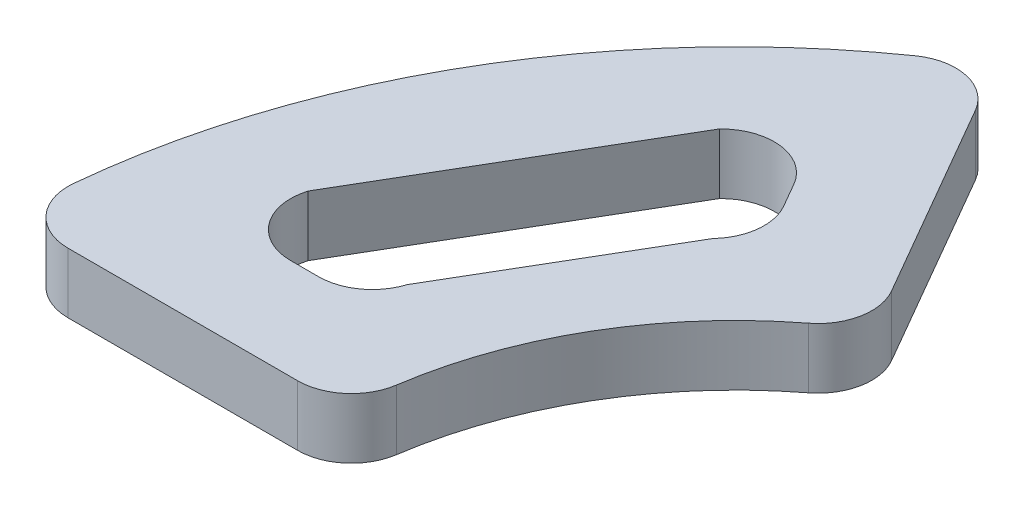
ISO-10303-21;
HEADER;
FILE_DESCRIPTION(('STEP AP214'),'2;1');
FILE_NAME('part.step','',(''),(''),'','','');
FILE_SCHEMA(('AUTOMOTIVE_DESIGN { 1 0 10303 214 1 1 1 1 }'));
ENDSEC;
DATA;
#1=APPLICATION_CONTEXT('core data for automotive mechanical design processes');
#2=APPLICATION_PROTOCOL_DEFINITION('international standard','automotive_design',2000,#1);
#3=PRODUCT_CONTEXT('',#1,'mechanical');
#4=PRODUCT('Part','Part','',(#3));
#5=PRODUCT_RELATED_PRODUCT_CATEGORY('part','',(#4));
#6=PRODUCT_DEFINITION_FORMATION('','',#4);
#7=PRODUCT_DEFINITION_CONTEXT('part definition',#1,'design');
#8=PRODUCT_DEFINITION('design','',#6,#7);
#9=PRODUCT_DEFINITION_SHAPE('','',#8);
#10=(LENGTH_UNIT() NAMED_UNIT(*) SI_UNIT(.MILLI.,.METRE.));
#11=(NAMED_UNIT(*) PLANE_ANGLE_UNIT() SI_UNIT($,.RADIAN.));
#12=(NAMED_UNIT(*) SI_UNIT($,.STERADIAN.) SOLID_ANGLE_UNIT());
#13=UNCERTAINTY_MEASURE_WITH_UNIT(LENGTH_MEASURE(1.E-05),#10,'distance_accuracy_value','');
#14=(GEOMETRIC_REPRESENTATION_CONTEXT(3) GLOBAL_UNCERTAINTY_ASSIGNED_CONTEXT((#13)) GLOBAL_UNIT_ASSIGNED_CONTEXT((#10,
#11,#12)) REPRESENTATION_CONTEXT('',''));
#15=CARTESIAN_POINT('',(0.,0.,0.));
#16=DIRECTION('',(0.,0.,1.));
#17=DIRECTION('',(1.,0.,0.));
#18=AXIS2_PLACEMENT_3D('',#15,#16,#17);
#19=CARTESIAN_POINT('',(-101.508620323596,4.5,-10.));
#20=DIRECTION('',(0.,1.,0.));
#21=DIRECTION('',(0.,0.,1.));
#22=AXIS2_PLACEMENT_3D('',#19,#20,#21);
#23=PLANE('',#22);
#24=CARTESIAN_POINT('',(-101.508620323596,4.5,-10.));
#25=DIRECTION('',(0.,1.,0.));
#26=DIRECTION('',(0.,0.,1.));
#27=AXIS2_PLACEMENT_3D('',#24,#25,#26);
#28=CIRCLE('',#27,8.);
#29=CARTESIAN_POINT('',(-109.470080741133,4.5,-10.7843137254902));
#30=VERTEX_POINT('',#29);
#31=CARTESIAN_POINT('',(-101.508620323596,4.5,-2.));
#32=VERTEX_POINT('',#31);
#33=EDGE_CURVE('E214',#30,#32,#28,.T.);
#34=ORIENTED_EDGE('',*,*,#33,.T.);
#35=DIRECTION('',(1.,0.,0.));
#36=VECTOR('',#35,1.);
#37=CARTESIAN_POINT('',(-101.508620323596,4.5,-2.));
#38=LINE('',#37,#36);
#39=CARTESIAN_POINT('',(-67.2606868832009,4.5,-2.));
#40=VERTEX_POINT('',#39);
#41=EDGE_CURVE('E217',#32,#40,#38,.T.);
#42=ORIENTED_EDGE('',*,*,#41,.T.);
#43=CARTESIAN_POINT('',(-67.2606868832009,4.5,-10.));
#44=DIRECTION('',(0.,1.,0.));
#45=DIRECTION('',(0.,0.,1.));
#46=AXIS2_PLACEMENT_3D('',#43,#44,#45);
#47=CIRCLE('',#46,8.);
#48=CARTESIAN_POINT('',(-59.347664896942,4.5,-8.82352941176468));
#49=VERTEX_POINT('',#48);
#50=EDGE_CURVE('E220',#40,#49,#47,.T.);
#51=ORIENTED_EDGE('',*,*,#50,.T.);
#52=CARTESIAN_POINT('',(0.,4.5,0.));
#53=DIRECTION('',(0.,-1.,0.));
#54=DIRECTION('',(0.,0.,-1.));
#55=AXIS2_PLACEMENT_3D('',#52,#53,#54);
#56=CIRCLE('',#55,60.);
#57=CARTESIAN_POINT('',(-36.6133401441332,4.5,-47.5338124232635));
#58=VERTEX_POINT('',#57);
#59=EDGE_CURVE('E222',#49,#58,#56,.T.);
#60=ORIENTED_EDGE('',*,*,#59,.T.);
#61=CARTESIAN_POINT('',(-41.4951188300176,4.5,-53.8716540796987));
#62=DIRECTION('',(0.,1.,0.));
#63=DIRECTION('',(0.,0.,-1.));
#64=AXIS2_PLACEMENT_3D('',#61,#62,#63);
#65=CIRCLE('',#64,8.);
#66=CARTESIAN_POINT('',(-34.5669155997421,4.5,-57.8716540796986));
#67=VERTEX_POINT('',#66);
#68=EDGE_CURVE('E224',#58,#67,#65,.T.);
#69=ORIENTED_EDGE('',*,*,#68,.T.);
#70=DIRECTION('',(-0.499999999999998,0.,-0.86602540378444));
#71=VECTOR('',#70,1.);
#72=CARTESIAN_POINT('',(-34.5669155997421,4.5,-57.8716540796986));
#73=LINE('',#72,#71);
#74=CARTESIAN_POINT('',(-51.6671080694126,4.5,-87.4900562563748));
#75=VERTEX_POINT('',#74);
#76=EDGE_CURVE('E226',#67,#75,#73,.T.);
#77=ORIENTED_EDGE('',*,*,#76,.T.);
#78=CARTESIAN_POINT('',(-58.5953112996881,4.5,-83.4900562563748));
#79=DIRECTION('',(0.,1.,0.));
#80=DIRECTION('',(0.,0.,1.));
#81=AXIS2_PLACEMENT_3D('',#78,#79,#80);
#82=CIRCLE('',#81,8.00000000000001);
#83=CARTESIAN_POINT('',(-63.1910219898598,4.5,-90.0382959627572));
#84=VERTEX_POINT('',#83);
#85=EDGE_CURVE('E228',#75,#84,#82,.T.);
#86=ORIENTED_EDGE('',*,*,#85,.T.);
#87=CARTESIAN_POINT('',(0.,4.5,0.));
#88=DIRECTION('',(0.,1.,0.));
#89=DIRECTION('',(0.,0.,-1.));
#90=AXIS2_PLACEMENT_3D('',#87,#88,#89);
#91=CIRCLE('',#90,110.);
#92=EDGE_CURVE('E230',#84,#30,#91,.T.);
#93=ORIENTED_EDGE('',*,*,#92,.T.);
#94=EDGE_LOOP('',(#34,#42,#51,#60,#69,#77,#86,#93));
#95=FACE_BOUND('',#94,.T.);
#96=DIRECTION('',(-0.505178122252813,0.,0.863015101140833));
#97=VECTOR('',#96,1.);
#98=CARTESIAN_POINT('',(-68.3527066906543,4.5,-65.9765677196183));
#99=LINE('',#98,#97);
#100=CARTESIAN_POINT('',(-68.3527066906543,4.5,-65.9765677196183));
#101=VERTEX_POINT('',#100);
#102=CARTESIAN_POINT('',(-90.9932566583893,4.5,-27.2988505747126));
#103=VERTEX_POINT('',#102);
#104=EDGE_CURVE('E157',#101,#103,#99,.T.);
#105=ORIENTED_EDGE('',*,*,#104,.F.);
#106=CARTESIAN_POINT('',(-62.5966892851256,4.5,-60.4206462274399));
#107=DIRECTION('',(0.,1.,0.));
#108=DIRECTION('',(0.,0.,1.));
#109=AXIS2_PLACEMENT_3D('',#106,#107,#108);
#110=CIRCLE('',#109,8.);
#111=CARTESIAN_POINT('',(-55.66848605485,4.5,-64.4206462274399));
#112=VERTEX_POINT('',#111);
#113=EDGE_CURVE('E149',#112,#101,#110,.T.);
#114=ORIENTED_EDGE('',*,*,#113,.F.);
#115=DIRECTION('',(-0.499999999999998,0.,-0.86602540378444));
#116=VECTOR('',#115,1.);
#117=CARTESIAN_POINT('',(-53.5836011765135,4.5,-60.8095196902289));
#118=LINE('',#117,#116);
#119=CARTESIAN_POINT('',(-53.5836011765135,4.5,-60.8095196902289));
#120=VERTEX_POINT('',#119);
#121=EDGE_CURVE('E182',#120,#112,#118,.T.);
#122=ORIENTED_EDGE('',*,*,#121,.F.);
#123=CARTESIAN_POINT('',(-60.511804406789,4.5,-56.8095196902289));
#124=DIRECTION('',(0.,1.,0.));
#125=DIRECTION('',(0.,0.,-1.));
#126=AXIS2_PLACEMENT_3D('',#123,#124,#125);
#127=CIRCLE('',#126,8.);
#128=CARTESIAN_POINT('',(-54.6793413314358,4.5,-51.3339033345442));
#129=VERTEX_POINT('',#128);
#130=EDGE_CURVE('E180',#129,#120,#127,.T.);
#131=ORIENTED_EDGE('',*,*,#130,.F.);
#132=DIRECTION('',(0.505450396565548,0.,-0.862855663834764));
#133=VECTOR('',#132,1.);
#134=CARTESIAN_POINT('',(-54.6793413314358,4.5,-51.3339033345442));
#135=LINE('',#134,#133);
#136=CARTESIAN_POINT('',(-71.5169600147327,4.5,-22.5903614457831));
#137=VERTEX_POINT('',#136);
#138=EDGE_CURVE('E178',#137,#129,#135,.T.);
#139=ORIENTED_EDGE('',*,*,#138,.F.);
#140=CARTESIAN_POINT('',(-79.1454357496375,4.5,-25.));
#141=DIRECTION('',(0.,1.,0.));
#142=DIRECTION('',(0.,0.,-1.));
#143=AXIS2_PLACEMENT_3D('',#140,#141,#142);
#144=CIRCLE('',#143,8.);
#145=CARTESIAN_POINT('',(-79.1454357496375,4.5,-17.));
#146=VERTEX_POINT('',#145);
#147=EDGE_CURVE('E176',#146,#137,#144,.T.);
#148=ORIENTED_EDGE('',*,*,#147,.F.);
#149=DIRECTION('',(1.,0.,0.));
#150=VECTOR('',#149,1.);
#151=CARTESIAN_POINT('',(-83.3306666239986,4.5,-17.));
#152=LINE('',#151,#150);
#153=CARTESIAN_POINT('',(-83.3306666239986,4.5,-17.));
#154=VERTEX_POINT('',#153);
#155=EDGE_CURVE('E172',#154,#146,#152,.T.);
#156=ORIENTED_EDGE('',*,*,#155,.F.);
#157=CARTESIAN_POINT('',(-83.3306666239986,4.5,-25.));
#158=DIRECTION('',(0.,1.,0.));
#159=DIRECTION('',(0.,0.,-1.));
#160=AXIS2_PLACEMENT_3D('',#157,#158,#159);
#161=CIRCLE('',#160,8.);
#162=EDGE_CURVE('E170',#103,#154,#161,.T.);
#163=ORIENTED_EDGE('',*,*,#162,.F.);
#164=EDGE_LOOP('',(#105,#114,#122,#131,#139,#148,#156,#163));
#165=FACE_BOUND('',#164,.T.);
#166=ADVANCED_FACE('F36',(#95,#165),#23,.T.);
#167=CARTESIAN_POINT('',(-101.508620323596,-4.5,-10.));
#168=DIRECTION('',(0.,1.,0.));
#169=DIRECTION('',(0.,0.,1.));
#170=AXIS2_PLACEMENT_3D('',#167,#168,#169);
#171=PLANE('',#170);
#172=CARTESIAN_POINT('',(-101.508620323596,-4.5,-10.));
#173=DIRECTION('',(0.,1.,0.));
#174=DIRECTION('',(0.,0.,1.));
#175=AXIS2_PLACEMENT_3D('',#172,#173,#174);
#176=CIRCLE('',#175,8.);
#177=CARTESIAN_POINT('',(-109.470080741133,-4.5,-10.7843137254902));
#178=VERTEX_POINT('',#177);
#179=CARTESIAN_POINT('',(-101.508620323596,-4.5,-2.));
#180=VERTEX_POINT('',#179);
#181=EDGE_CURVE('E165',#178,#180,#176,.T.);
#182=ORIENTED_EDGE('',*,*,#181,.F.);
#183=CARTESIAN_POINT('',(0.,-4.5,0.));
#184=DIRECTION('',(0.,1.,0.));
#185=DIRECTION('',(0.,0.,-1.));
#186=AXIS2_PLACEMENT_3D('',#183,#184,#185);
#187=CIRCLE('',#186,110.);
#188=CARTESIAN_POINT('',(-63.1910219898598,-4.5,-90.0382959627572));
#189=VERTEX_POINT('',#188);
#190=EDGE_CURVE('E218',#189,#178,#187,.T.);
#191=ORIENTED_EDGE('',*,*,#190,.F.);
#192=CARTESIAN_POINT('',(-58.5953112996881,-4.5,-83.4900562563748));
#193=DIRECTION('',(0.,1.,0.));
#194=DIRECTION('',(0.,0.,1.));
#195=AXIS2_PLACEMENT_3D('',#192,#193,#194);
#196=CIRCLE('',#195,8.00000000000001);
#197=CARTESIAN_POINT('',(-51.6671080694126,-4.5,-87.4900562563748));
#198=VERTEX_POINT('',#197);
#199=EDGE_CURVE('E245',#198,#189,#196,.T.);
#200=ORIENTED_EDGE('',*,*,#199,.F.);
#201=DIRECTION('',(-0.499999999999998,0.,-0.86602540378444));
#202=VECTOR('',#201,1.);
#203=CARTESIAN_POINT('',(-34.5669155997421,-4.5,-57.8716540796986));
#204=LINE('',#203,#202);
#205=CARTESIAN_POINT('',(-34.5669155997421,-4.5,-57.8716540796986));
#206=VERTEX_POINT('',#205);
#207=EDGE_CURVE('E243',#206,#198,#204,.T.);
#208=ORIENTED_EDGE('',*,*,#207,.F.);
#209=CARTESIAN_POINT('',(-41.4951188300176,-4.5,-53.8716540796987));
#210=DIRECTION('',(0.,1.,0.));
#211=DIRECTION('',(0.,0.,-1.));
#212=AXIS2_PLACEMENT_3D('',#209,#210,#211);
#213=CIRCLE('',#212,8.);
#214=CARTESIAN_POINT('',(-36.6133401441332,-4.5,-47.5338124232635));
#215=VERTEX_POINT('',#214);
#216=EDGE_CURVE('E241',#215,#206,#213,.T.);
#217=ORIENTED_EDGE('',*,*,#216,.F.);
#218=CARTESIAN_POINT('',(0.,-4.5,0.));
#219=DIRECTION('',(0.,-1.,0.));
#220=DIRECTION('',(0.,0.,-1.));
#221=AXIS2_PLACEMENT_3D('',#218,#219,#220);
#222=CIRCLE('',#221,60.);
#223=CARTESIAN_POINT('',(-59.347664896942,-4.5,-8.82352941176468));
#224=VERTEX_POINT('',#223);
#225=EDGE_CURVE('E239',#224,#215,#222,.T.);
#226=ORIENTED_EDGE('',*,*,#225,.F.);
#227=CARTESIAN_POINT('',(-67.2606868832009,-4.5,-10.));
#228=DIRECTION('',(0.,1.,0.));
#229=DIRECTION('',(0.,0.,1.));
#230=AXIS2_PLACEMENT_3D('',#227,#228,#229);
#231=CIRCLE('',#230,8.);
#232=CARTESIAN_POINT('',(-67.2606868832009,-4.5,-2.));
#233=VERTEX_POINT('',#232);
#234=EDGE_CURVE('E237',#233,#224,#231,.T.);
#235=ORIENTED_EDGE('',*,*,#234,.F.);
#236=DIRECTION('',(1.,0.,0.));
#237=VECTOR('',#236,1.);
#238=CARTESIAN_POINT('',(-101.508620323596,-4.5,-2.));
#239=LINE('',#238,#237);
#240=EDGE_CURVE('E235',#180,#233,#239,.T.);
#241=ORIENTED_EDGE('',*,*,#240,.F.);
#242=EDGE_LOOP('',(#182,#191,#200,#208,#217,#226,#235,#241));
#243=FACE_BOUND('',#242,.T.);
#244=CARTESIAN_POINT('',(-62.5966892851256,-4.5,-60.4206462274399));
#245=DIRECTION('',(0.,1.,0.));
#246=DIRECTION('',(0.,0.,1.));
#247=AXIS2_PLACEMENT_3D('',#244,#245,#246);
#248=CIRCLE('',#247,8.);
#249=CARTESIAN_POINT('',(-55.66848605485,-4.5,-64.4206462274399));
#250=VERTEX_POINT('',#249);
#251=CARTESIAN_POINT('',(-68.3527066906543,-4.5,-65.9765677196183));
#252=VERTEX_POINT('',#251);
#253=EDGE_CURVE('E59',#250,#252,#248,.T.);
#254=ORIENTED_EDGE('',*,*,#253,.T.);
#255=DIRECTION('',(-0.505178122252813,0.,0.863015101140833));
#256=VECTOR('',#255,1.);
#257=CARTESIAN_POINT('',(-68.3527066906543,-4.5,-65.9765677196183));
#258=LINE('',#257,#256);
#259=CARTESIAN_POINT('',(-90.9932566583893,-4.5,-27.2988505747126));
#260=VERTEX_POINT('',#259);
#261=EDGE_CURVE('E164',#252,#260,#258,.T.);
#262=ORIENTED_EDGE('',*,*,#261,.T.);
#263=CARTESIAN_POINT('',(-83.3306666239986,-4.5,-25.));
#264=DIRECTION('',(0.,1.,0.));
#265=DIRECTION('',(0.,0.,-1.));
#266=AXIS2_PLACEMENT_3D('',#263,#264,#265);
#267=CIRCLE('',#266,8.);
#268=CARTESIAN_POINT('',(-83.3306666239986,-4.5,-17.));
#269=VERTEX_POINT('',#268);
#270=EDGE_CURVE('E186',#260,#269,#267,.T.);
#271=ORIENTED_EDGE('',*,*,#270,.T.);
#272=DIRECTION('',(1.,0.,0.));
#273=VECTOR('',#272,1.);
#274=CARTESIAN_POINT('',(-83.3306666239986,-4.5,-17.));
#275=LINE('',#274,#273);
#276=CARTESIAN_POINT('',(-79.1454357496375,-4.5,-17.));
#277=VERTEX_POINT('',#276);
#278=EDGE_CURVE('E189',#269,#277,#275,.T.);
#279=ORIENTED_EDGE('',*,*,#278,.T.);
#280=CARTESIAN_POINT('',(-79.1454357496375,-4.5,-25.));
#281=DIRECTION('',(0.,1.,0.));
#282=DIRECTION('',(0.,0.,-1.));
#283=AXIS2_PLACEMENT_3D('',#280,#281,#282);
#284=CIRCLE('',#283,8.);
#285=CARTESIAN_POINT('',(-71.5169600147327,-4.5,-22.5903614457831));
#286=VERTEX_POINT('',#285);
#287=EDGE_CURVE('E192',#277,#286,#284,.T.);
#288=ORIENTED_EDGE('',*,*,#287,.T.);
#289=DIRECTION('',(0.505450396565548,0.,-0.862855663834764));
#290=VECTOR('',#289,1.);
#291=CARTESIAN_POINT('',(-54.6793413314358,-4.5,-51.3339033345442));
#292=LINE('',#291,#290);
#293=CARTESIAN_POINT('',(-54.6793413314358,-4.5,-51.3339033345442));
#294=VERTEX_POINT('',#293);
#295=EDGE_CURVE('E195',#286,#294,#292,.T.);
#296=ORIENTED_EDGE('',*,*,#295,.T.);
#297=CARTESIAN_POINT('',(-60.511804406789,-4.5,-56.8095196902289));
#298=DIRECTION('',(0.,1.,0.));
#299=DIRECTION('',(0.,0.,-1.));
#300=AXIS2_PLACEMENT_3D('',#297,#298,#299);
#301=CIRCLE('',#300,8.);
#302=CARTESIAN_POINT('',(-53.5836011765135,-4.5,-60.8095196902289));
#303=VERTEX_POINT('',#302);
#304=EDGE_CURVE('E198',#294,#303,#301,.T.);
#305=ORIENTED_EDGE('',*,*,#304,.T.);
#306=DIRECTION('',(-0.499999999999998,0.,-0.86602540378444));
#307=VECTOR('',#306,1.);
#308=CARTESIAN_POINT('',(-53.5836011765135,-4.5,-60.8095196902289));
#309=LINE('',#308,#307);
#310=EDGE_CURVE('E158',#303,#250,#309,.T.);
#311=ORIENTED_EDGE('',*,*,#310,.T.);
#312=EDGE_LOOP('',(#254,#262,#271,#279,#288,#296,#305,#311));
#313=FACE_BOUND('',#312,.T.);
#314=ADVANCED_FACE('F275',(#243,#313),#171,.F.);
#315=CARTESIAN_POINT('',(-101.508620323596,4.5,-10.));
#316=DIRECTION('',(0.,-1.,0.));
#317=DIRECTION('',(0.,0.,-1.));
#318=AXIS2_PLACEMENT_3D('',#315,#316,#317);
#319=CYLINDRICAL_SURFACE('',#318,8.);
#320=ORIENTED_EDGE('',*,*,#181,.T.);
#321=DIRECTION('',(0.,-1.,0.));
#322=VECTOR('',#321,1.);
#323=CARTESIAN_POINT('',(-101.508620323596,4.5,-2.));
#324=LINE('',#323,#322);
#325=EDGE_CURVE('E11',#32,#180,#324,.T.);
#326=ORIENTED_EDGE('',*,*,#325,.F.);
#327=ORIENTED_EDGE('',*,*,#33,.F.);
#328=DIRECTION('',(0.,-1.,0.));
#329=VECTOR('',#328,1.);
#330=CARTESIAN_POINT('',(-109.470080741133,4.5,-10.7843137254902));
#331=LINE('',#330,#329);
#332=EDGE_CURVE('E232',#30,#178,#331,.T.);
#333=ORIENTED_EDGE('',*,*,#332,.T.);
#334=EDGE_LOOP('',(#320,#326,#327,#333));
#335=FACE_BOUND('',#334,.T.);
#336=ADVANCED_FACE('F38',(#335),#319,.T.);
#337=CARTESIAN_POINT('',(-101.508620323596,4.5,-2.));
#338=DIRECTION('',(0.,0.,-1.));
#339=DIRECTION('',(-1.,0.,0.));
#340=AXIS2_PLACEMENT_3D('',#337,#338,#339);
#341=PLANE('',#340);
#342=ORIENTED_EDGE('',*,*,#240,.T.);
#343=DIRECTION('',(0.,-1.,0.));
#344=VECTOR('',#343,1.);
#345=CARTESIAN_POINT('',(-67.2606868832009,4.5,-2.));
#346=LINE('',#345,#344);
#347=EDGE_CURVE('E44',#40,#233,#346,.T.);
#348=ORIENTED_EDGE('',*,*,#347,.F.);
#349=ORIENTED_EDGE('',*,*,#41,.F.);
#350=ORIENTED_EDGE('',*,*,#325,.T.);
#351=EDGE_LOOP('',(#342,#348,#349,#350));
#352=FACE_BOUND('',#351,.T.);
#353=ADVANCED_FACE('F292',(#352),#341,.F.);
#354=CARTESIAN_POINT('',(-67.2606868832009,4.5,-10.));
#355=DIRECTION('',(0.,-1.,0.));
#356=DIRECTION('',(0.,0.,-1.));
#357=AXIS2_PLACEMENT_3D('',#354,#355,#356);
#358=CYLINDRICAL_SURFACE('',#357,8.);
#359=ORIENTED_EDGE('',*,*,#234,.T.);
#360=DIRECTION('',(0.,-1.,0.));
#361=VECTOR('',#360,1.);
#362=CARTESIAN_POINT('',(-59.347664896942,4.5,-8.82352941176468));
#363=LINE('',#362,#361);
#364=EDGE_CURVE('E262',#49,#224,#363,.T.);
#365=ORIENTED_EDGE('',*,*,#364,.F.);
#366=ORIENTED_EDGE('',*,*,#50,.F.);
#367=ORIENTED_EDGE('',*,*,#347,.T.);
#368=EDGE_LOOP('',(#359,#365,#366,#367));
#369=FACE_BOUND('',#368,.T.);
#370=ADVANCED_FACE('F269',(#369),#358,.T.);
#371=CARTESIAN_POINT('',(0.,4.5,0.));
#372=DIRECTION('',(0.,-1.,0.));
#373=DIRECTION('',(0.,0.,-1.));
#374=AXIS2_PLACEMENT_3D('',#371,#372,#373);
#375=CYLINDRICAL_SURFACE('',#374,60.);
#376=ORIENTED_EDGE('',*,*,#225,.T.);
#377=DIRECTION('',(0.,-1.,0.));
#378=VECTOR('',#377,1.);
#379=CARTESIAN_POINT('',(-36.6133401441332,4.5,-47.5338124232635));
#380=LINE('',#379,#378);
#381=EDGE_CURVE('E259',#58,#215,#380,.T.);
#382=ORIENTED_EDGE('',*,*,#381,.F.);
#383=ORIENTED_EDGE('',*,*,#59,.F.);
#384=ORIENTED_EDGE('',*,*,#364,.T.);
#385=EDGE_LOOP('',(#376,#382,#383,#384));
#386=FACE_BOUND('',#385,.T.);
#387=ADVANCED_FACE('F281',(#386),#375,.F.);
#388=CARTESIAN_POINT('',(-41.4951188300176,4.5,-53.8716540796987));
#389=DIRECTION('',(0.,-1.,0.));
#390=DIRECTION('',(0.,0.,-1.));
#391=AXIS2_PLACEMENT_3D('',#388,#389,#390);
#392=CYLINDRICAL_SURFACE('',#391,8.);
#393=ORIENTED_EDGE('',*,*,#216,.T.);
#394=DIRECTION('',(0.,-1.,0.));
#395=VECTOR('',#394,1.);
#396=CARTESIAN_POINT('',(-34.5669155997421,4.5,-57.8716540796986));
#397=LINE('',#396,#395);
#398=EDGE_CURVE('E256',#67,#206,#397,.T.);
#399=ORIENTED_EDGE('',*,*,#398,.F.);
#400=ORIENTED_EDGE('',*,*,#68,.F.);
#401=ORIENTED_EDGE('',*,*,#381,.T.);
#402=EDGE_LOOP('',(#393,#399,#400,#401));
#403=FACE_BOUND('',#402,.T.);
#404=ADVANCED_FACE('F285',(#403),#392,.T.);
#405=CARTESIAN_POINT('',(-34.5669155997421,4.5,-57.8716540796986));
#406=DIRECTION('',(-0.86602540378444,0.,0.499999999999998));
#407=DIRECTION('',(0.499999999999998,0.,0.86602540378444));
#408=AXIS2_PLACEMENT_3D('',#405,#406,#407);
#409=PLANE('',#408);
#410=ORIENTED_EDGE('',*,*,#207,.T.);
#411=DIRECTION('',(0.,-1.,0.));
#412=VECTOR('',#411,1.);
#413=CARTESIAN_POINT('',(-51.6671080694126,4.5,-87.4900562563748));
#414=LINE('',#413,#412);
#415=EDGE_CURVE('E253',#75,#198,#414,.T.);
#416=ORIENTED_EDGE('',*,*,#415,.F.);
#417=ORIENTED_EDGE('',*,*,#76,.F.);
#418=ORIENTED_EDGE('',*,*,#398,.T.);
#419=EDGE_LOOP('',(#410,#416,#417,#418));
#420=FACE_BOUND('',#419,.T.);
#421=ADVANCED_FACE('F305',(#420),#409,.F.);
#422=CARTESIAN_POINT('',(-58.5953112996881,4.5,-83.4900562563748));
#423=DIRECTION('',(0.,-1.,0.));
#424=DIRECTION('',(0.,0.,-1.));
#425=AXIS2_PLACEMENT_3D('',#422,#423,#424);
#426=CYLINDRICAL_SURFACE('',#425,8.00000000000001);
#427=ORIENTED_EDGE('',*,*,#199,.T.);
#428=DIRECTION('',(0.,-1.,0.));
#429=VECTOR('',#428,1.);
#430=CARTESIAN_POINT('',(-63.1910219898598,4.5,-90.0382959627572));
#431=LINE('',#430,#429);
#432=EDGE_CURVE('E250',#84,#189,#431,.T.);
#433=ORIENTED_EDGE('',*,*,#432,.F.);
#434=ORIENTED_EDGE('',*,*,#85,.F.);
#435=ORIENTED_EDGE('',*,*,#415,.T.);
#436=EDGE_LOOP('',(#427,#433,#434,#435));
#437=FACE_BOUND('',#436,.T.);
#438=ADVANCED_FACE('F303',(#437),#426,.T.);
#439=CARTESIAN_POINT('',(0.,4.5,0.));
#440=DIRECTION('',(0.,-1.,0.));
#441=DIRECTION('',(0.,0.,-1.));
#442=AXIS2_PLACEMENT_3D('',#439,#440,#441);
#443=CYLINDRICAL_SURFACE('',#442,110.);
#444=ORIENTED_EDGE('',*,*,#190,.T.);
#445=ORIENTED_EDGE('',*,*,#332,.F.);
#446=ORIENTED_EDGE('',*,*,#92,.F.);
#447=ORIENTED_EDGE('',*,*,#432,.T.);
#448=EDGE_LOOP('',(#444,#445,#446,#447));
#449=FACE_BOUND('',#448,.T.);
#450=ADVANCED_FACE('F298',(#449),#443,.T.);
#451=CARTESIAN_POINT('',(-62.5966892851256,4.5,-60.4206462274399));
#452=DIRECTION('',(0.,-1.,0.));
#453=DIRECTION('',(0.,0.,-1.));
#454=AXIS2_PLACEMENT_3D('',#451,#452,#453);
#455=CYLINDRICAL_SURFACE('',#454,8.);
#456=ORIENTED_EDGE('',*,*,#253,.F.);
#457=DIRECTION('',(0.,-1.,0.));
#458=VECTOR('',#457,1.);
#459=CARTESIAN_POINT('',(-55.66848605485,4.5,-64.4206462274399));
#460=LINE('',#459,#458);
#461=EDGE_CURVE('E153',#112,#250,#460,.T.);
#462=ORIENTED_EDGE('',*,*,#461,.F.);
#463=ORIENTED_EDGE('',*,*,#113,.T.);
#464=DIRECTION('',(0.,-1.,0.));
#465=VECTOR('',#464,1.);
#466=CARTESIAN_POINT('',(-68.3527066906543,4.5,-65.9765677196183));
#467=LINE('',#466,#465);
#468=EDGE_CURVE('E152',#101,#252,#467,.T.);
#469=ORIENTED_EDGE('',*,*,#468,.T.);
#470=EDGE_LOOP('',(#456,#462,#463,#469));
#471=FACE_BOUND('',#470,.T.);
#472=ADVANCED_FACE('F151',(#471),#455,.F.);
#473=CARTESIAN_POINT('',(-68.3527066906543,4.5,-65.9765677196183));
#474=DIRECTION('',(0.863015101140833,0.,0.505178122252813));
#475=DIRECTION('',(0.505178122252813,0.,-0.863015101140833));
#476=AXIS2_PLACEMENT_3D('',#473,#474,#475);
#477=PLANE('',#476);
#478=ORIENTED_EDGE('',*,*,#261,.F.);
#479=ORIENTED_EDGE('',*,*,#468,.F.);
#480=ORIENTED_EDGE('',*,*,#104,.T.);
#481=DIRECTION('',(0.,-1.,0.));
#482=VECTOR('',#481,1.);
#483=CARTESIAN_POINT('',(-90.9932566583893,4.5,-27.2988505747126));
#484=LINE('',#483,#482);
#485=EDGE_CURVE('E166',#103,#260,#484,.T.);
#486=ORIENTED_EDGE('',*,*,#485,.T.);
#487=EDGE_LOOP('',(#478,#479,#480,#486));
#488=FACE_BOUND('',#487,.T.);
#489=ADVANCED_FACE('F161',(#488),#477,.T.);
#490=CARTESIAN_POINT('',(-83.3306666239986,4.5,-25.));
#491=DIRECTION('',(0.,-1.,0.));
#492=DIRECTION('',(0.,0.,-1.));
#493=AXIS2_PLACEMENT_3D('',#490,#491,#492);
#494=CYLINDRICAL_SURFACE('',#493,8.);
#495=ORIENTED_EDGE('',*,*,#270,.F.);
#496=ORIENTED_EDGE('',*,*,#485,.F.);
#497=ORIENTED_EDGE('',*,*,#162,.T.);
#498=DIRECTION('',(0.,-1.,0.));
#499=VECTOR('',#498,1.);
#500=CARTESIAN_POINT('',(-83.3306666239986,4.5,-17.));
#501=LINE('',#500,#499);
#502=EDGE_CURVE('E211',#154,#269,#501,.T.);
#503=ORIENTED_EDGE('',*,*,#502,.T.);
#504=EDGE_LOOP('',(#495,#496,#497,#503));
#505=FACE_BOUND('',#504,.T.);
#506=ADVANCED_FACE('F330',(#505),#494,.F.);
#507=CARTESIAN_POINT('',(-83.3306666239986,4.5,-17.));
#508=DIRECTION('',(0.,0.,-1.));
#509=DIRECTION('',(-1.,0.,0.));
#510=AXIS2_PLACEMENT_3D('',#507,#508,#509);
#511=PLANE('',#510);
#512=ORIENTED_EDGE('',*,*,#278,.F.);
#513=ORIENTED_EDGE('',*,*,#502,.F.);
#514=ORIENTED_EDGE('',*,*,#155,.T.);
#515=DIRECTION('',(0.,-1.,0.));
#516=VECTOR('',#515,1.);
#517=CARTESIAN_POINT('',(-79.1454357496375,4.5,-17.));
#518=LINE('',#517,#516);
#519=EDGE_CURVE('E209',#146,#277,#518,.T.);
#520=ORIENTED_EDGE('',*,*,#519,.T.);
#521=EDGE_LOOP('',(#512,#513,#514,#520));
#522=FACE_BOUND('',#521,.T.);
#523=ADVANCED_FACE('F334',(#522),#511,.T.);
#524=CARTESIAN_POINT('',(-79.1454357496375,4.5,-25.));
#525=DIRECTION('',(0.,-1.,0.));
#526=DIRECTION('',(0.,0.,-1.));
#527=AXIS2_PLACEMENT_3D('',#524,#525,#526);
#528=CYLINDRICAL_SURFACE('',#527,8.);
#529=ORIENTED_EDGE('',*,*,#287,.F.);
#530=ORIENTED_EDGE('',*,*,#519,.F.);
#531=ORIENTED_EDGE('',*,*,#147,.T.);
#532=DIRECTION('',(0.,-1.,0.));
#533=VECTOR('',#532,1.);
#534=CARTESIAN_POINT('',(-71.5169600147327,4.5,-22.5903614457831));
#535=LINE('',#534,#533);
#536=EDGE_CURVE('E207',#137,#286,#535,.T.);
#537=ORIENTED_EDGE('',*,*,#536,.T.);
#538=EDGE_LOOP('',(#529,#530,#531,#537));
#539=FACE_BOUND('',#538,.T.);
#540=ADVANCED_FACE('F340',(#539),#528,.F.);
#541=CARTESIAN_POINT('',(-54.6793413314358,4.5,-51.3339033345442));
#542=DIRECTION('',(-0.862855663834764,0.,-0.505450396565547));
#543=DIRECTION('',(-0.505450396565548,0.,0.862855663834764));
#544=AXIS2_PLACEMENT_3D('',#541,#542,#543);
#545=PLANE('',#544);
#546=ORIENTED_EDGE('',*,*,#295,.F.);
#547=ORIENTED_EDGE('',*,*,#536,.F.);
#548=ORIENTED_EDGE('',*,*,#138,.T.);
#549=DIRECTION('',(0.,-1.,0.));
#550=VECTOR('',#549,1.);
#551=CARTESIAN_POINT('',(-54.6793413314358,4.5,-51.3339033345442));
#552=LINE('',#551,#550);
#553=EDGE_CURVE('E205',#129,#294,#552,.T.);
#554=ORIENTED_EDGE('',*,*,#553,.T.);
#555=EDGE_LOOP('',(#546,#547,#548,#554));
#556=FACE_BOUND('',#555,.T.);
#557=ADVANCED_FACE('F344',(#556),#545,.T.);
#558=CARTESIAN_POINT('',(-60.511804406789,4.5,-56.8095196902289));
#559=DIRECTION('',(0.,-1.,0.));
#560=DIRECTION('',(0.,0.,-1.));
#561=AXIS2_PLACEMENT_3D('',#558,#559,#560);
#562=CYLINDRICAL_SURFACE('',#561,8.);
#563=ORIENTED_EDGE('',*,*,#304,.F.);
#564=ORIENTED_EDGE('',*,*,#553,.F.);
#565=ORIENTED_EDGE('',*,*,#130,.T.);
#566=DIRECTION('',(0.,-1.,0.));
#567=VECTOR('',#566,1.);
#568=CARTESIAN_POINT('',(-53.5836011765135,4.5,-60.8095196902289));
#569=LINE('',#568,#567);
#570=EDGE_CURVE('E51',#120,#303,#569,.T.);
#571=ORIENTED_EDGE('',*,*,#570,.T.);
#572=EDGE_LOOP('',(#563,#564,#565,#571));
#573=FACE_BOUND('',#572,.T.);
#574=ADVANCED_FACE('F348',(#573),#562,.F.);
#575=CARTESIAN_POINT('',(-53.5836011765135,4.5,-60.8095196902289));
#576=DIRECTION('',(-0.86602540378444,0.,0.499999999999998));
#577=DIRECTION('',(0.499999999999998,0.,0.86602540378444));
#578=AXIS2_PLACEMENT_3D('',#575,#576,#577);
#579=PLANE('',#578);
#580=ORIENTED_EDGE('',*,*,#310,.F.);
#581=ORIENTED_EDGE('',*,*,#570,.F.);
#582=ORIENTED_EDGE('',*,*,#121,.T.);
#583=ORIENTED_EDGE('',*,*,#461,.T.);
#584=EDGE_LOOP('',(#580,#581,#582,#583));
#585=FACE_BOUND('',#584,.T.);
#586=ADVANCED_FACE('F352',(#585),#579,.T.);
#587=CLOSED_SHELL('',(#166,#314,#336,#353,#370,#387,#404,#421,#438,#450,#472,#489,#506,#523,
#540,#557,#574,#586));
#588=MANIFOLD_SOLID_BREP('B2',#587);
#589=ADVANCED_BREP_SHAPE_REPRESENTATION('',(#18,#588),#14);
#590=SHAPE_DEFINITION_REPRESENTATION(#9,#589);
ENDSEC;
END-ISO-10303-21;
